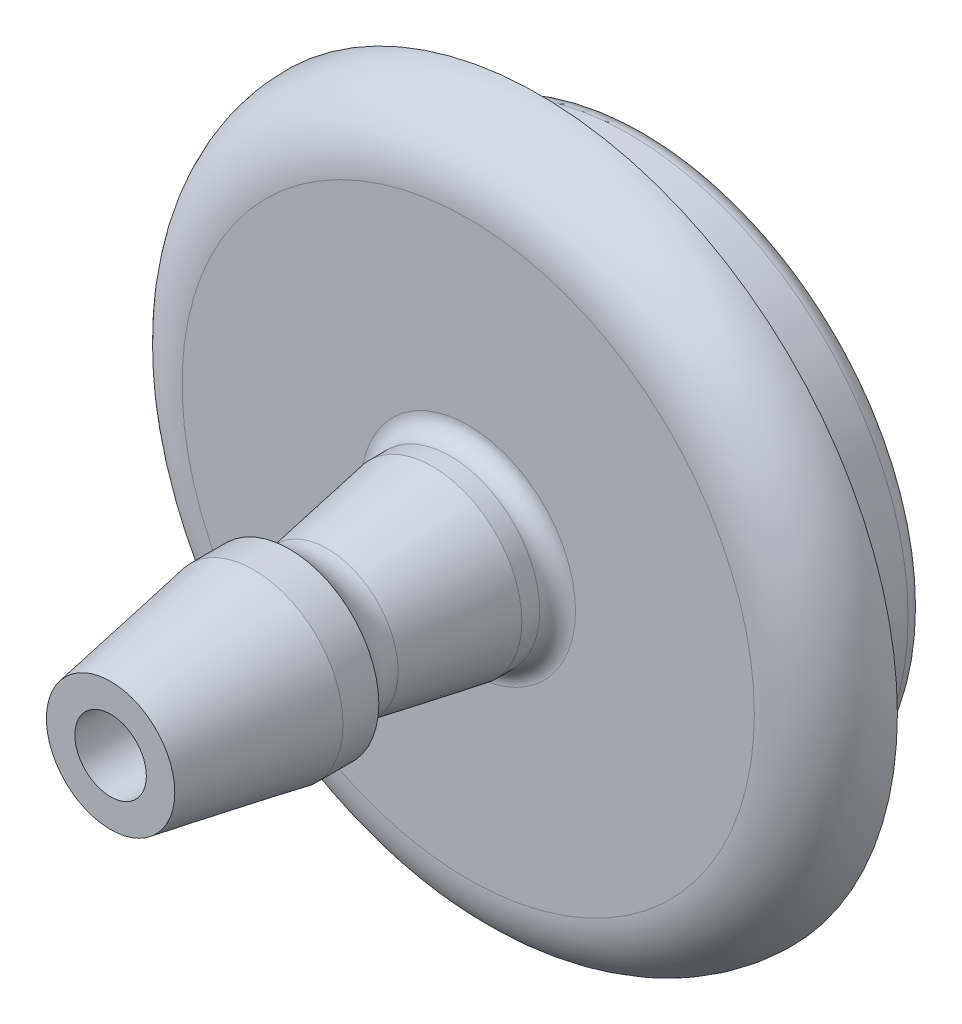
ISO-10303-21;
HEADER;
FILE_DESCRIPTION(('STEP AP214'),'2;1');
FILE_NAME('part.step','',(''),(''),'','','');
FILE_SCHEMA(('AUTOMOTIVE_DESIGN { 1 0 10303 214 1 1 1 1 }'));
ENDSEC;
DATA;
#1=APPLICATION_CONTEXT('core data for automotive mechanical design processes');
#2=APPLICATION_PROTOCOL_DEFINITION('international standard','automotive_design',2000,#1);
#3=PRODUCT_CONTEXT('',#1,'mechanical');
#4=PRODUCT('Part','Part','',(#3));
#5=PRODUCT_RELATED_PRODUCT_CATEGORY('part','',(#4));
#6=PRODUCT_DEFINITION_FORMATION('','',#4);
#7=PRODUCT_DEFINITION_CONTEXT('part definition',#1,'design');
#8=PRODUCT_DEFINITION('design','',#6,#7);
#9=PRODUCT_DEFINITION_SHAPE('','',#8);
#10=(LENGTH_UNIT() NAMED_UNIT(*) SI_UNIT(.MILLI.,.METRE.));
#11=(NAMED_UNIT(*) PLANE_ANGLE_UNIT() SI_UNIT($,.RADIAN.));
#12=(NAMED_UNIT(*) SI_UNIT($,.STERADIAN.) SOLID_ANGLE_UNIT());
#13=UNCERTAINTY_MEASURE_WITH_UNIT(LENGTH_MEASURE(1.E-05),#10,'distance_accuracy_value','');
#14=(GEOMETRIC_REPRESENTATION_CONTEXT(3) GLOBAL_UNCERTAINTY_ASSIGNED_CONTEXT((#13)) GLOBAL_UNIT_ASSIGNED_CONTEXT((#10,
#11,#12)) REPRESENTATION_CONTEXT('',''));
#15=CARTESIAN_POINT('',(0.,0.,0.));
#16=DIRECTION('',(0.,0.,1.));
#17=DIRECTION('',(1.,0.,0.));
#18=AXIS2_PLACEMENT_3D('',#15,#16,#17);
#19=CARTESIAN_POINT('',(0.,0.,-2.));
#20=DIRECTION('',(0.,0.,1.));
#21=DIRECTION('',(1.,0.,0.));
#22=AXIS2_PLACEMENT_3D('',#19,#20,#21);
#23=PLANE('',#22);
#24=CARTESIAN_POINT('',(0.,0.,-2.));
#25=DIRECTION('',(0.,0.,1.));
#26=DIRECTION('',(1.,0.,0.));
#27=AXIS2_PLACEMENT_3D('',#24,#25,#26);
#28=CIRCLE('',#27,3.);
#29=CARTESIAN_POINT('',(3.,0.,-2.));
#30=VERTEX_POINT('',#29);
#31=EDGE_CURVE('E57',#30,#30,#28,.T.);
#32=ORIENTED_EDGE('',*,*,#31,.T.);
#33=EDGE_LOOP('',(#32));
#34=FACE_BOUND('',#33,.T.);
#35=CARTESIAN_POINT('',(0.,0.,-2.));
#36=DIRECTION('',(0.,0.,1.));
#37=DIRECTION('',(1.,0.,0.));
#38=AXIS2_PLACEMENT_3D('',#35,#36,#37);
#39=CIRCLE('',#38,6.);
#40=CARTESIAN_POINT('',(6.,0.,-2.));
#41=VERTEX_POINT('',#40);
#42=EDGE_CURVE('E53',#41,#41,#39,.T.);
#43=ORIENTED_EDGE('',*,*,#42,.F.);
#44=EDGE_LOOP('',(#43));
#45=FACE_BOUND('',#44,.T.);
#46=ADVANCED_FACE('F30',(#34,#45),#23,.F.);
#47=CARTESIAN_POINT('',(0.,0.,5.));
#48=DIRECTION('',(0.,0.,-1.));
#49=DIRECTION('',(-1.,0.,0.));
#50=AXIS2_PLACEMENT_3D('',#47,#48,#49);
#51=CYLINDRICAL_SURFACE('',#50,2.5);
#52=CARTESIAN_POINT('',(0.,0.,0.5));
#53=DIRECTION('',(0.,0.,1.));
#54=DIRECTION('',(1.,0.,0.));
#55=AXIS2_PLACEMENT_3D('',#52,#53,#54);
#56=CIRCLE('',#55,2.5);
#57=CARTESIAN_POINT('',(2.5,0.,0.5));
#58=VERTEX_POINT('',#57);
#59=EDGE_CURVE('E45',#58,#58,#56,.T.);
#60=ORIENTED_EDGE('',*,*,#59,.T.);
#61=EDGE_LOOP('',(#60));
#62=FACE_BOUND('',#61,.T.);
#63=CARTESIAN_POINT('',(0.,0.,0.999999999999935));
#64=DIRECTION('',(0.,0.,1.));
#65=DIRECTION('',(1.,0.,0.));
#66=AXIS2_PLACEMENT_3D('',#63,#64,#65);
#67=CIRCLE('',#66,2.5);
#68=CARTESIAN_POINT('',(2.5,0.,0.999999999999935));
#69=VERTEX_POINT('',#68);
#70=EDGE_CURVE('E69',#69,#69,#67,.F.);
#71=ORIENTED_EDGE('',*,*,#70,.T.);
#72=EDGE_LOOP('',(#71));
#73=FACE_BOUND('',#72,.T.);
#74=ADVANCED_FACE('F100',(#62,#73),#51,.T.);
#75=CARTESIAN_POINT('',(0.,0.,5.));
#76=DIRECTION('',(0.,0.,-1.));
#77=DIRECTION('',(-1.,0.,0.));
#78=AXIS2_PLACEMENT_3D('',#75,#76,#77);
#79=CYLINDRICAL_SURFACE('',#78,1.);
#80=CARTESIAN_POINT('',(0.,0.,0.));
#81=DIRECTION('',(0.,0.,1.));
#82=DIRECTION('',(1.,0.,0.));
#83=AXIS2_PLACEMENT_3D('',#80,#81,#82);
#84=CIRCLE('',#83,1.);
#85=CARTESIAN_POINT('',(1.,0.,0.));
#86=VERTEX_POINT('',#85);
#87=EDGE_CURVE('E54',#86,#86,#84,.F.);
#88=ORIENTED_EDGE('',*,*,#87,.T.);
#89=EDGE_LOOP('',(#88));
#90=FACE_BOUND('',#89,.T.);
#91=CARTESIAN_POINT('',(0.,0.,10.));
#92=DIRECTION('',(0.,0.,1.));
#93=DIRECTION('',(1.,0.,0.));
#94=AXIS2_PLACEMENT_3D('',#91,#92,#93);
#95=CIRCLE('',#94,1.);
#96=CARTESIAN_POINT('',(1.,0.,10.));
#97=VERTEX_POINT('',#96);
#98=EDGE_CURVE('E75',#97,#97,#95,.T.);
#99=ORIENTED_EDGE('',*,*,#98,.T.);
#100=EDGE_LOOP('',(#99));
#101=FACE_BOUND('',#100,.T.);
#102=ADVANCED_FACE('F108',(#90,#101),#79,.F.);
#103=CARTESIAN_POINT('',(0.,0.,5.));
#104=DIRECTION('',(0.,0.,-1.));
#105=DIRECTION('',(-1.,0.,0.));
#106=AXIS2_PLACEMENT_3D('',#103,#104,#105);
#107=CONICAL_SURFACE('',#106,1.79469207716614,0.17453292519943);
#108=CARTESIAN_POINT('',(0.,0.,3.94162981419659));
#109=DIRECTION('',(0.,0.,-1.));
#110=DIRECTION('',(-1.,0.,0.));
#111=AXIS2_PLACEMENT_3D('',#108,#109,#110);
#112=CIRCLE('',#111,1.98131129650071);
#113=CARTESIAN_POINT('',(-1.98131129650071,0.,3.94162981419659));
#114=VERTEX_POINT('',#113);
#115=EDGE_CURVE('E60',#114,#114,#112,.T.);
#116=ORIENTED_EDGE('',*,*,#115,.T.);
#117=EDGE_LOOP('',(#116));
#118=FACE_BOUND('',#117,.T.);
#119=ORIENTED_EDGE('',*,*,#70,.F.);
#120=EDGE_LOOP('',(#119));
#121=FACE_BOUND('',#120,.T.);
#122=ADVANCED_FACE('F153',(#118,#121),#107,.T.);
#123=CARTESIAN_POINT('',(0.,0.,10.));
#124=DIRECTION('',(0.,0.,1.));
#125=DIRECTION('',(1.,0.,0.));
#126=AXIS2_PLACEMENT_3D('',#123,#124,#125);
#127=PLANE('',#126);
#128=CARTESIAN_POINT('',(0.,0.,10.));
#129=DIRECTION('',(0.,0.,1.));
#130=DIRECTION('',(1.,0.,0.));
#131=AXIS2_PLACEMENT_3D('',#128,#129,#130);
#132=CIRCLE('',#131,1.79469207716614);
#133=CARTESIAN_POINT('',(1.79469207716614,0.,10.));
#134=VERTEX_POINT('',#133);
#135=EDGE_CURVE('E66',#134,#134,#132,.T.);
#136=ORIENTED_EDGE('',*,*,#135,.T.);
#137=EDGE_LOOP('',(#136));
#138=FACE_BOUND('',#137,.T.);
#139=ORIENTED_EDGE('',*,*,#98,.F.);
#140=EDGE_LOOP('',(#139));
#141=FACE_BOUND('',#140,.T.);
#142=ADVANCED_FACE('F155',(#138,#141),#127,.T.);
#143=CARTESIAN_POINT('',(0.,0.,10.));
#144=DIRECTION('',(0.,0.,-1.));
#145=DIRECTION('',(-1.,0.,0.));
#146=AXIS2_PLACEMENT_3D('',#143,#144,#145);
#147=CYLINDRICAL_SURFACE('',#146,2.5);
#148=CARTESIAN_POINT('',(0.,0.,5.99999999999994));
#149=DIRECTION('',(0.,0.,1.));
#150=DIRECTION('',(1.,0.,0.));
#151=AXIS2_PLACEMENT_3D('',#148,#149,#150);
#152=CIRCLE('',#151,2.5);
#153=CARTESIAN_POINT('',(2.5,0.,5.99999999999994));
#154=VERTEX_POINT('',#153);
#155=EDGE_CURVE('E63',#154,#154,#152,.F.);
#156=ORIENTED_EDGE('',*,*,#155,.T.);
#157=EDGE_LOOP('',(#156));
#158=FACE_BOUND('',#157,.T.);
#159=CARTESIAN_POINT('',(0.,0.,5.));
#160=DIRECTION('',(0.,0.,1.));
#161=DIRECTION('',(1.,0.,0.));
#162=AXIS2_PLACEMENT_3D('',#159,#160,#161);
#163=CIRCLE('',#162,2.5);
#164=CARTESIAN_POINT('',(2.5,0.,5.));
#165=VERTEX_POINT('',#164);
#166=EDGE_CURVE('E72',#165,#165,#163,.T.);
#167=ORIENTED_EDGE('',*,*,#166,.T.);
#168=EDGE_LOOP('',(#167));
#169=FACE_BOUND('',#168,.T.);
#170=ADVANCED_FACE('F151',(#158,#169),#147,.T.);
#171=CARTESIAN_POINT('',(0.,0.,10.));
#172=DIRECTION('',(0.,0.,-1.));
#173=DIRECTION('',(-1.,0.,0.));
#174=AXIS2_PLACEMENT_3D('',#171,#172,#173);
#175=CONICAL_SURFACE('',#174,1.79469207716614,0.17453292519943);
#176=ORIENTED_EDGE('',*,*,#155,.F.);
#177=EDGE_LOOP('',(#176));
#178=FACE_BOUND('',#177,.T.);
#179=ORIENTED_EDGE('',*,*,#135,.F.);
#180=EDGE_LOOP('',(#179));
#181=FACE_BOUND('',#180,.T.);
#182=ADVANCED_FACE('F124',(#178,#181),#175,.T.);
#183=CARTESIAN_POINT('',(0.,0.,4.11527799186352));
#184=DIRECTION('',(0.,0.,1.));
#185=DIRECTION('',(1.,0.,0.));
#186=AXIS2_PLACEMENT_3D('',#183,#184,#185);
#187=TOROIDAL_SURFACE('',#186,2.96611904951292,1.);
#188=ORIENTED_EDGE('',*,*,#115,.F.);
#189=EDGE_LOOP('',(#188));
#190=FACE_BOUND('',#189,.T.);
#191=ORIENTED_EDGE('',*,*,#166,.F.);
#192=EDGE_LOOP('',(#191));
#193=FACE_BOUND('',#192,.T.);
#194=ADVANCED_FACE('F115',(#190,#193),#187,.F.);
#195=CARTESIAN_POINT('',(0.,0.,-2.));
#196=DIRECTION('',(0.,0.,1.));
#197=DIRECTION('',(1.,0.,0.));
#198=AXIS2_PLACEMENT_3D('',#195,#196,#197);
#199=CIRCLE('',#198,7.8);
#200=CARTESIAN_POINT('',(7.8,0.,-2.));
#201=VERTEX_POINT('',#200);
#202=EDGE_CURVE('E81',#201,#201,#199,.T.);
#203=ORIENTED_EDGE('',*,*,#202,.T.);
#204=EDGE_LOOP('',(#203));
#205=FACE_BOUND('',#204,.T.);
#206=CARTESIAN_POINT('',(0.,0.,-2.));
#207=DIRECTION('',(0.,0.,1.));
#208=DIRECTION('',(1.,0.,0.));
#209=AXIS2_PLACEMENT_3D('',#206,#207,#208);
#210=CIRCLE('',#209,10.);
#211=CARTESIAN_POINT('',(10.,0.,-2.));
#212=VERTEX_POINT('',#211);
#213=EDGE_CURVE('E78',#212,#212,#210,.T.);
#214=ORIENTED_EDGE('',*,*,#213,.F.);
#215=EDGE_LOOP('',(#214));
#216=FACE_BOUND('',#215,.T.);
#217=ADVANCED_FACE('F103',(#205,#216),#23,.F.);
#218=CARTESIAN_POINT('',(0.,0.,0.));
#219=DIRECTION('',(0.,0.,1.));
#220=DIRECTION('',(1.,0.,0.));
#221=AXIS2_PLACEMENT_3D('',#218,#219,#220);
#222=PLANE('',#221);
#223=CARTESIAN_POINT('',(0.,0.,0.));
#224=DIRECTION('',(0.,0.,1.));
#225=DIRECTION('',(1.,0.,0.));
#226=AXIS2_PLACEMENT_3D('',#223,#224,#225);
#227=CIRCLE('',#226,3.);
#228=CARTESIAN_POINT('',(3.,0.,0.));
#229=VERTEX_POINT('',#228);
#230=EDGE_CURVE('E41',#229,#229,#227,.F.);
#231=ORIENTED_EDGE('',*,*,#230,.T.);
#232=EDGE_LOOP('',(#231));
#233=FACE_BOUND('',#232,.T.);
#234=CARTESIAN_POINT('',(0.,0.,0.));
#235=DIRECTION('',(0.,0.,1.));
#236=DIRECTION('',(1.,0.,0.));
#237=AXIS2_PLACEMENT_3D('',#234,#235,#236);
#238=CIRCLE('',#237,8.);
#239=CARTESIAN_POINT('',(8.,0.,0.));
#240=VERTEX_POINT('',#239);
#241=EDGE_CURVE('E50',#240,#240,#238,.T.);
#242=ORIENTED_EDGE('',*,*,#241,.T.);
#243=EDGE_LOOP('',(#242));
#244=FACE_BOUND('',#243,.T.);
#245=ADVANCED_FACE('F114',(#233,#244),#222,.T.);
#246=CARTESIAN_POINT('',(0.,0.,0.));
#247=DIRECTION('',(0.,0.,1.));
#248=DIRECTION('',(1.,0.,0.));
#249=AXIS2_PLACEMENT_3D('',#246,#247,#248);
#250=TOROIDAL_SURFACE('',#249,3.,2.);
#251=ORIENTED_EDGE('',*,*,#87,.F.);
#252=EDGE_LOOP('',(#251));
#253=FACE_BOUND('',#252,.T.);
#254=ORIENTED_EDGE('',*,*,#31,.F.);
#255=EDGE_LOOP('',(#254));
#256=FACE_BOUND('',#255,.T.);
#257=ADVANCED_FACE('F122',(#253,#256),#250,.T.);
#258=CARTESIAN_POINT('',(0.,0.,-5.));
#259=DIRECTION('',(0.,0.,1.));
#260=DIRECTION('',(1.,0.,0.));
#261=AXIS2_PLACEMENT_3D('',#258,#259,#260);
#262=CYLINDRICAL_SURFACE('',#261,7.8);
#263=CARTESIAN_POINT('',(0.,0.,-4.5));
#264=DIRECTION('',(0.,0.,1.));
#265=DIRECTION('',(1.,0.,0.));
#266=AXIS2_PLACEMENT_3D('',#263,#264,#265);
#267=CIRCLE('',#266,7.8);
#268=CARTESIAN_POINT('',(7.8,0.,-4.5));
#269=VERTEX_POINT('',#268);
#270=EDGE_CURVE('E37',#269,#269,#267,.T.);
#271=ORIENTED_EDGE('',*,*,#270,.T.);
#272=EDGE_LOOP('',(#271));
#273=FACE_BOUND('',#272,.T.);
#274=ORIENTED_EDGE('',*,*,#202,.F.);
#275=EDGE_LOOP('',(#274));
#276=FACE_BOUND('',#275,.T.);
#277=ADVANCED_FACE('F95',(#273,#276),#262,.T.);
#278=CARTESIAN_POINT('',(0.,0.,-5.));
#279=DIRECTION('',(0.,0.,1.));
#280=DIRECTION('',(1.,0.,0.));
#281=AXIS2_PLACEMENT_3D('',#278,#279,#280);
#282=CYLINDRICAL_SURFACE('',#281,6.);
#283=CARTESIAN_POINT('',(0.,0.,-5.));
#284=DIRECTION('',(0.,0.,1.));
#285=DIRECTION('',(1.,0.,0.));
#286=AXIS2_PLACEMENT_3D('',#283,#284,#285);
#287=CIRCLE('',#286,6.);
#288=CARTESIAN_POINT('',(6.,0.,-5.));
#289=VERTEX_POINT('',#288);
#290=EDGE_CURVE('E84',#289,#289,#287,.T.);
#291=ORIENTED_EDGE('',*,*,#290,.F.);
#292=EDGE_LOOP('',(#291));
#293=FACE_BOUND('',#292,.T.);
#294=ORIENTED_EDGE('',*,*,#42,.T.);
#295=EDGE_LOOP('',(#294));
#296=FACE_BOUND('',#295,.T.);
#297=ADVANCED_FACE('F92',(#293,#296),#282,.F.);
#298=CARTESIAN_POINT('',(0.,0.,-5.));
#299=DIRECTION('',(0.,0.,1.));
#300=DIRECTION('',(1.,0.,0.));
#301=AXIS2_PLACEMENT_3D('',#298,#299,#300);
#302=PLANE('',#301);
#303=CARTESIAN_POINT('',(0.,0.,-5.));
#304=DIRECTION('',(0.,0.,1.));
#305=DIRECTION('',(1.,0.,0.));
#306=AXIS2_PLACEMENT_3D('',#303,#304,#305);
#307=CIRCLE('',#306,7.3);
#308=CARTESIAN_POINT('',(7.3,0.,-5.));
#309=VERTEX_POINT('',#308);
#310=EDGE_CURVE('E10',#309,#309,#307,.F.);
#311=ORIENTED_EDGE('',*,*,#310,.T.);
#312=EDGE_LOOP('',(#311));
#313=FACE_BOUND('',#312,.T.);
#314=ORIENTED_EDGE('',*,*,#290,.T.);
#315=EDGE_LOOP('',(#314));
#316=FACE_BOUND('',#315,.T.);
#317=ADVANCED_FACE('F90',(#313,#316),#302,.F.);
#318=CARTESIAN_POINT('',(0.,0.,-2.));
#319=DIRECTION('',(0.,0.,1.));
#320=DIRECTION('',(1.,0.,0.));
#321=AXIS2_PLACEMENT_3D('',#318,#319,#320);
#322=TOROIDAL_SURFACE('',#321,8.,2.);
#323=ORIENTED_EDGE('',*,*,#213,.T.);
#324=EDGE_LOOP('',(#323));
#325=FACE_BOUND('',#324,.T.);
#326=ORIENTED_EDGE('',*,*,#241,.F.);
#327=EDGE_LOOP('',(#326));
#328=FACE_BOUND('',#327,.T.);
#329=ADVANCED_FACE('F131',(#325,#328),#322,.T.);
#330=CARTESIAN_POINT('',(0.,0.,0.5));
#331=DIRECTION('',(0.,0.,1.));
#332=DIRECTION('',(1.,0.,0.));
#333=AXIS2_PLACEMENT_3D('',#330,#331,#332);
#334=TOROIDAL_SURFACE('',#333,3.,0.5);
#335=ORIENTED_EDGE('',*,*,#230,.F.);
#336=EDGE_LOOP('',(#335));
#337=FACE_BOUND('',#336,.T.);
#338=ORIENTED_EDGE('',*,*,#59,.F.);
#339=EDGE_LOOP('',(#338));
#340=FACE_BOUND('',#339,.T.);
#341=ADVANCED_FACE('F134',(#337,#340),#334,.F.);
#342=CARTESIAN_POINT('',(0.,0.,-4.5));
#343=DIRECTION('',(0.,0.,1.));
#344=DIRECTION('',(1.,0.,0.));
#345=AXIS2_PLACEMENT_3D('',#342,#343,#344);
#346=TOROIDAL_SURFACE('',#345,7.3,0.5);
#347=ORIENTED_EDGE('',*,*,#310,.F.);
#348=EDGE_LOOP('',(#347));
#349=FACE_BOUND('',#348,.T.);
#350=ORIENTED_EDGE('',*,*,#270,.F.);
#351=EDGE_LOOP('',(#350));
#352=FACE_BOUND('',#351,.T.);
#353=ADVANCED_FACE('F32',(#349,#352),#346,.T.);
#354=CLOSED_SHELL('',(#46,#74,#102,#122,#142,#170,#182,#194,#217,#245,#257,#277,#297,#317,#329,
#341,#353));
#355=MANIFOLD_SOLID_BREP('B2',#354);
#356=ADVANCED_BREP_SHAPE_REPRESENTATION('',(#18,#355),#14);
#357=SHAPE_DEFINITION_REPRESENTATION(#9,#356);
ENDSEC;
END-ISO-10303-21;
